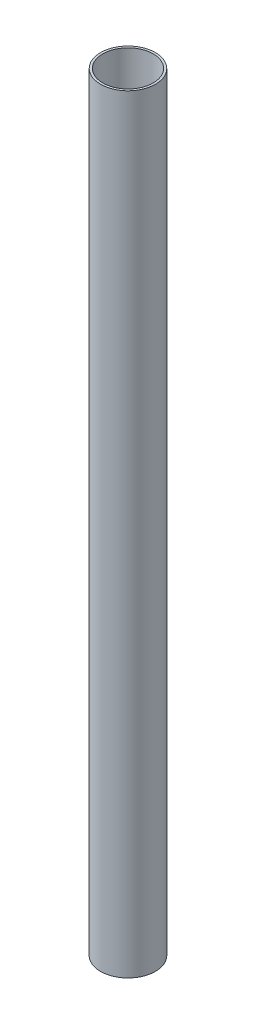
ISO-10303-21;
HEADER;
FILE_DESCRIPTION(('STEP AP214'),'2;1');
FILE_NAME('part.step','',(''),(''),'','','');
FILE_SCHEMA(('AUTOMOTIVE_DESIGN { 1 0 10303 214 1 1 1 1 }'));
ENDSEC;
DATA;
#1=APPLICATION_CONTEXT('core data for automotive mechanical design processes');
#2=APPLICATION_PROTOCOL_DEFINITION('international standard','automotive_design',2000,#1);
#3=PRODUCT_CONTEXT('',#1,'mechanical');
#4=PRODUCT('Part','Part','',(#3));
#5=PRODUCT_RELATED_PRODUCT_CATEGORY('part','',(#4));
#6=PRODUCT_DEFINITION_FORMATION('','',#4);
#7=PRODUCT_DEFINITION_CONTEXT('part definition',#1,'design');
#8=PRODUCT_DEFINITION('design','',#6,#7);
#9=PRODUCT_DEFINITION_SHAPE('','',#8);
#10=(LENGTH_UNIT() NAMED_UNIT(*) SI_UNIT(.MILLI.,.METRE.));
#11=(NAMED_UNIT(*) PLANE_ANGLE_UNIT() SI_UNIT($,.RADIAN.));
#12=(NAMED_UNIT(*) SI_UNIT($,.STERADIAN.) SOLID_ANGLE_UNIT());
#13=UNCERTAINTY_MEASURE_WITH_UNIT(LENGTH_MEASURE(1.E-05),#10,'distance_accuracy_value','');
#14=(GEOMETRIC_REPRESENTATION_CONTEXT(3) GLOBAL_UNCERTAINTY_ASSIGNED_CONTEXT((#13)) GLOBAL_UNIT_ASSIGNED_CONTEXT((#10,
#11,#12)) REPRESENTATION_CONTEXT('',''));
#15=CARTESIAN_POINT('',(0.,0.,0.));
#16=DIRECTION('',(0.,0.,1.));
#17=DIRECTION('',(1.,0.,0.));
#18=AXIS2_PLACEMENT_3D('',#15,#16,#17);
#19=CARTESIAN_POINT('',(0.,700.,0.));
#20=DIRECTION('',(0.,1.,0.));
#21=DIRECTION('',(0.,0.,1.));
#22=AXIS2_PLACEMENT_3D('',#19,#20,#21);
#23=PLANE('',#22);
#24=CARTESIAN_POINT('',(0.,700.,0.));
#25=DIRECTION('',(0.,1.,0.));
#26=DIRECTION('',(0.,0.,1.));
#27=AXIS2_PLACEMENT_3D('',#24,#25,#26);
#28=CIRCLE('',#27,25.);
#29=CARTESIAN_POINT('',(0.,700.,25.));
#30=VERTEX_POINT('',#29);
#31=EDGE_CURVE('E10',#30,#30,#28,.T.);
#32=ORIENTED_EDGE('',*,*,#31,.T.);
#33=EDGE_LOOP('',(#32));
#34=FACE_BOUND('',#33,.T.);
#35=CARTESIAN_POINT('',(0.,700.,0.));
#36=DIRECTION('',(0.,1.,0.));
#37=DIRECTION('',(0.,0.,1.));
#38=AXIS2_PLACEMENT_3D('',#35,#36,#37);
#39=CIRCLE('',#38,23.);
#40=CARTESIAN_POINT('',(0.,700.,23.));
#41=VERTEX_POINT('',#40);
#42=EDGE_CURVE('E45',#41,#41,#39,.T.);
#43=ORIENTED_EDGE('',*,*,#42,.F.);
#44=EDGE_LOOP('',(#43));
#45=FACE_BOUND('',#44,.T.);
#46=ADVANCED_FACE('F34',(#34,#45),#23,.T.);
#47=CARTESIAN_POINT('',(0.,0.,0.));
#48=DIRECTION('',(0.,1.,0.));
#49=DIRECTION('',(0.,0.,1.));
#50=AXIS2_PLACEMENT_3D('',#47,#48,#49);
#51=PLANE('',#50);
#52=CARTESIAN_POINT('',(0.,0.,0.));
#53=DIRECTION('',(0.,1.,0.));
#54=DIRECTION('',(0.,0.,1.));
#55=AXIS2_PLACEMENT_3D('',#52,#53,#54);
#56=CIRCLE('',#55,25.);
#57=CARTESIAN_POINT('',(0.,0.,25.));
#58=VERTEX_POINT('',#57);
#59=EDGE_CURVE('E38',#58,#58,#56,.T.);
#60=ORIENTED_EDGE('',*,*,#59,.F.);
#61=EDGE_LOOP('',(#60));
#62=FACE_BOUND('',#61,.T.);
#63=CARTESIAN_POINT('',(0.,0.,0.));
#64=DIRECTION('',(0.,1.,0.));
#65=DIRECTION('',(0.,0.,1.));
#66=AXIS2_PLACEMENT_3D('',#63,#64,#65);
#67=CIRCLE('',#66,23.);
#68=CARTESIAN_POINT('',(0.,0.,23.));
#69=VERTEX_POINT('',#68);
#70=EDGE_CURVE('E47',#69,#69,#67,.T.);
#71=ORIENTED_EDGE('',*,*,#70,.T.);
#72=EDGE_LOOP('',(#71));
#73=FACE_BOUND('',#72,.T.);
#74=ADVANCED_FACE('F57',(#62,#73),#51,.F.);
#75=CARTESIAN_POINT('',(0.,700.,0.));
#76=DIRECTION('',(0.,-1.,0.));
#77=DIRECTION('',(0.,0.,-1.));
#78=AXIS2_PLACEMENT_3D('',#75,#76,#77);
#79=CYLINDRICAL_SURFACE('',#78,25.);
#80=ORIENTED_EDGE('',*,*,#31,.F.);
#81=EDGE_LOOP('',(#80));
#82=FACE_BOUND('',#81,.T.);
#83=ORIENTED_EDGE('',*,*,#59,.T.);
#84=EDGE_LOOP('',(#83));
#85=FACE_BOUND('',#84,.T.);
#86=ADVANCED_FACE('F36',(#82,#85),#79,.T.);
#87=CARTESIAN_POINT('',(0.,700.,0.));
#88=DIRECTION('',(0.,-1.,0.));
#89=DIRECTION('',(0.,0.,-1.));
#90=AXIS2_PLACEMENT_3D('',#87,#88,#89);
#91=CYLINDRICAL_SURFACE('',#90,23.);
#92=ORIENTED_EDGE('',*,*,#42,.T.);
#93=EDGE_LOOP('',(#92));
#94=FACE_BOUND('',#93,.T.);
#95=ORIENTED_EDGE('',*,*,#70,.F.);
#96=EDGE_LOOP('',(#95));
#97=FACE_BOUND('',#96,.T.);
#98=ADVANCED_FACE('F53',(#94,#97),#91,.F.);
#99=CLOSED_SHELL('',(#46,#74,#86,#98));
#100=MANIFOLD_SOLID_BREP('B2',#99);
#101=ADVANCED_BREP_SHAPE_REPRESENTATION('',(#18,#100),#14);
#102=SHAPE_DEFINITION_REPRESENTATION(#9,#101);
ENDSEC;
END-ISO-10303-21;
